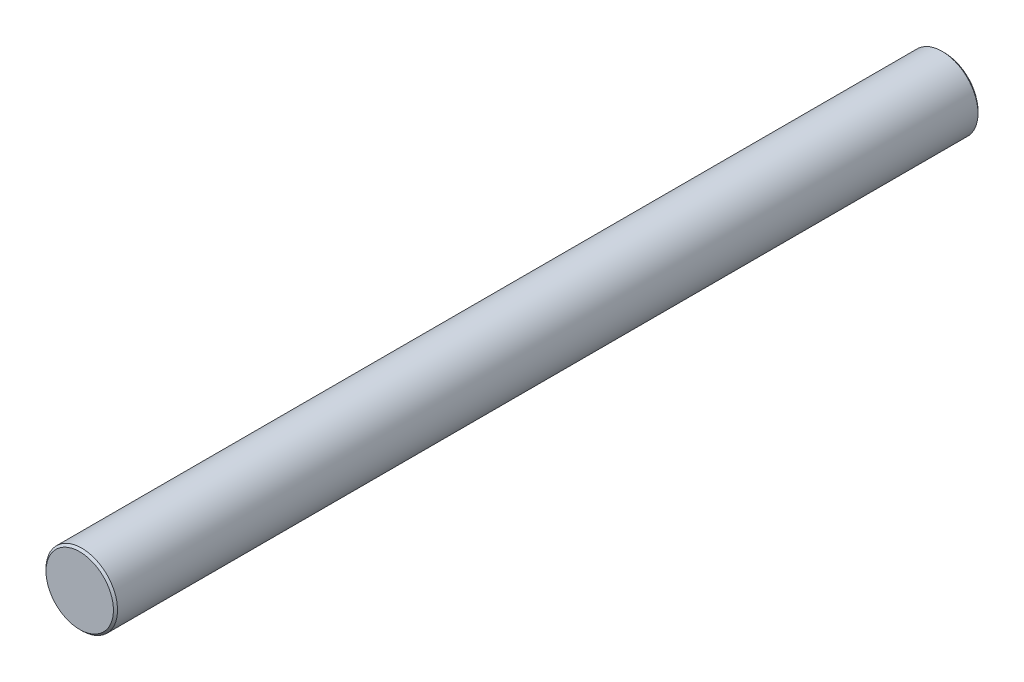
ISO-10303-21;
HEADER;
FILE_DESCRIPTION(('STEP AP214'),'2;1');
FILE_NAME('part.step','',(''),(''),'','','');
FILE_SCHEMA(('AUTOMOTIVE_DESIGN { 1 0 10303 214 1 1 1 1 }'));
ENDSEC;
DATA;
#1=APPLICATION_CONTEXT('core data for automotive mechanical design processes');
#2=APPLICATION_PROTOCOL_DEFINITION('international standard','automotive_design',2000,#1);
#3=PRODUCT_CONTEXT('',#1,'mechanical');
#4=PRODUCT('Part','Part','',(#3));
#5=PRODUCT_RELATED_PRODUCT_CATEGORY('part','',(#4));
#6=PRODUCT_DEFINITION_FORMATION('','',#4);
#7=PRODUCT_DEFINITION_CONTEXT('part definition',#1,'design');
#8=PRODUCT_DEFINITION('design','',#6,#7);
#9=PRODUCT_DEFINITION_SHAPE('','',#8);
#10=(LENGTH_UNIT() NAMED_UNIT(*) SI_UNIT(.MILLI.,.METRE.));
#11=(NAMED_UNIT(*) PLANE_ANGLE_UNIT() SI_UNIT($,.RADIAN.));
#12=(NAMED_UNIT(*) SI_UNIT($,.STERADIAN.) SOLID_ANGLE_UNIT());
#13=UNCERTAINTY_MEASURE_WITH_UNIT(LENGTH_MEASURE(1.E-05),#10,'distance_accuracy_value','');
#14=(GEOMETRIC_REPRESENTATION_CONTEXT(3) GLOBAL_UNCERTAINTY_ASSIGNED_CONTEXT((#13)) GLOBAL_UNIT_ASSIGNED_CONTEXT((#10,
#11,#12)) REPRESENTATION_CONTEXT('',''));
#15=CARTESIAN_POINT('',(0.,0.,0.));
#16=DIRECTION('',(0.,0.,1.));
#17=DIRECTION('',(1.,0.,0.));
#18=AXIS2_PLACEMENT_3D('',#15,#16,#17);
#19=CARTESIAN_POINT('',(0.,0.,42.));
#20=DIRECTION('',(0.,0.,-1.));
#21=DIRECTION('',(-1.,0.,0.));
#22=AXIS2_PLACEMENT_3D('',#19,#20,#21);
#23=CYLINDRICAL_SURFACE('',#22,3.475);
#24=CARTESIAN_POINT('',(0.,0.,-41.7999999999999));
#25=DIRECTION('',(0.,0.,1.));
#26=DIRECTION('',(1.,0.,0.));
#27=AXIS2_PLACEMENT_3D('',#24,#25,#26);
#28=CIRCLE('',#27,3.475);
#29=CARTESIAN_POINT('',(-3.475,0.,-41.7999999999999));
#30=VERTEX_POINT('',#29);
#31=EDGE_CURVE('E49',#30,#30,#28,.T.);
#32=CARTESIAN_POINT('',(0.,0.,41.8000000000001));
#33=DIRECTION('',(0.,0.,1.));
#34=DIRECTION('',(1.,0.,0.));
#35=AXIS2_PLACEMENT_3D('',#32,#33,#34);
#36=CIRCLE('',#35,3.475);
#37=CARTESIAN_POINT('',(-3.475,0.,41.8000000000001));
#38=VERTEX_POINT('',#37);
#39=EDGE_CURVE('E53',#38,#38,#36,.F.);
#40=CARTESIAN_POINT('',(-3.475,0.,-41.7999999999999));
#41=CARTESIAN_POINT('',(-3.475,0.,-40.9291666666666));
#42=CARTESIAN_POINT('',(-3.475,0.,-40.0583333333333));
#43=CARTESIAN_POINT('',(-3.475,0.,-38.3166666666666));
#44=CARTESIAN_POINT('',(-3.475,0.,-37.4458333333333));
#45=CARTESIAN_POINT('',(-3.475,0.,-35.7041666666666));
#46=CARTESIAN_POINT('',(-3.475,0.,-34.8333333333333));
#47=CARTESIAN_POINT('',(-3.475,0.,-33.0916666666666));
#48=CARTESIAN_POINT('',(-3.475,0.,-32.2208333333333));
#49=CARTESIAN_POINT('',(-3.475,0.,-30.4791666666666));
#50=CARTESIAN_POINT('',(-3.475,0.,-29.6083333333333));
#51=CARTESIAN_POINT('',(-3.475,0.,-27.8666666666666));
#52=CARTESIAN_POINT('',(-3.475,0.,-26.9958333333333));
#53=CARTESIAN_POINT('',(-3.475,0.,-25.2541666666666));
#54=CARTESIAN_POINT('',(-3.475,0.,-24.3833333333333));
#55=CARTESIAN_POINT('',(-3.475,0.,-22.6416666666666));
#56=CARTESIAN_POINT('',(-3.475,0.,-21.7708333333333));
#57=CARTESIAN_POINT('',(-3.475,0.,-20.0291666666666));
#58=CARTESIAN_POINT('',(-3.475,0.,-19.1583333333333));
#59=CARTESIAN_POINT('',(-3.475,0.,-17.4166666666666));
#60=CARTESIAN_POINT('',(-3.475,0.,-16.5458333333333));
#61=CARTESIAN_POINT('',(-3.475,0.,-14.8041666666666));
#62=CARTESIAN_POINT('',(-3.475,0.,-13.9333333333333));
#63=CARTESIAN_POINT('',(-3.475,0.,-12.1916666666666));
#64=CARTESIAN_POINT('',(-3.475,0.,-11.3208333333333));
#65=CARTESIAN_POINT('',(-3.475,0.,-9.57916666666661));
#66=CARTESIAN_POINT('',(-3.475,0.,-8.70833333333328));
#67=CARTESIAN_POINT('',(-3.475,0.,-6.96666666666661));
#68=CARTESIAN_POINT('',(-3.475,0.,-6.09583333333328));
#69=CARTESIAN_POINT('',(-3.475,0.,-4.35416666666661));
#70=CARTESIAN_POINT('',(-3.475,0.,-3.48333333333328));
#71=CARTESIAN_POINT('',(-3.475,0.,-1.74166666666661));
#72=CARTESIAN_POINT('',(-3.475,0.,-0.870833333333279));
#73=CARTESIAN_POINT('',(-3.475,0.,0.87083333333339));
#74=CARTESIAN_POINT('',(-3.475,0.,1.74166666666672));
#75=CARTESIAN_POINT('',(-3.475,0.,3.48333333333339));
#76=CARTESIAN_POINT('',(-3.475,0.,4.35416666666672));
#77=CARTESIAN_POINT('',(-3.475,0.,6.09583333333339));
#78=CARTESIAN_POINT('',(-3.475,0.,6.96666666666672));
#79=CARTESIAN_POINT('',(-3.475,0.,8.70833333333339));
#80=CARTESIAN_POINT('',(-3.475,0.,9.57916666666672));
#81=CARTESIAN_POINT('',(-3.475,0.,11.3208333333334));
#82=CARTESIAN_POINT('',(-3.475,0.,12.1916666666667));
#83=CARTESIAN_POINT('',(-3.475,0.,13.9333333333334));
#84=CARTESIAN_POINT('',(-3.475,0.,14.8041666666667));
#85=CARTESIAN_POINT('',(-3.475,0.,16.5458333333334));
#86=CARTESIAN_POINT('',(-3.475,0.,17.4166666666667));
#87=CARTESIAN_POINT('',(-3.475,0.,19.1583333333334));
#88=CARTESIAN_POINT('',(-3.475,0.,20.0291666666667));
#89=CARTESIAN_POINT('',(-3.475,0.,21.7708333333334));
#90=CARTESIAN_POINT('',(-3.475,0.,22.6416666666667));
#91=CARTESIAN_POINT('',(-3.475,0.,24.3833333333334));
#92=CARTESIAN_POINT('',(-3.475,0.,25.2541666666667));
#93=CARTESIAN_POINT('',(-3.475,0.,26.9958333333334));
#94=CARTESIAN_POINT('',(-3.475,0.,27.8666666666667));
#95=CARTESIAN_POINT('',(-3.475,0.,29.6083333333334));
#96=CARTESIAN_POINT('',(-3.475,0.,30.4791666666667));
#97=CARTESIAN_POINT('',(-3.475,0.,32.2208333333334));
#98=CARTESIAN_POINT('',(-3.475,0.,33.0916666666667));
#99=CARTESIAN_POINT('',(-3.475,0.,34.8333333333334));
#100=CARTESIAN_POINT('',(-3.475,0.,35.7041666666667));
#101=CARTESIAN_POINT('',(-3.475,0.,37.4458333333334));
#102=CARTESIAN_POINT('',(-3.475,0.,38.3166666666667));
#103=CARTESIAN_POINT('',(-3.475,0.,40.0583333333334));
#104=CARTESIAN_POINT('',(-3.475,0.,40.9291666666667));
#105=CARTESIAN_POINT('',(-3.475,0.,41.8000000000001));
#106=B_SPLINE_CURVE_WITH_KNOTS('',3,(#40,#41,#42,#43,#44,#45,#46,#47,#48,#49,#50,#51,#52,#53,
#54,#55,#56,#57,#58,#59,#60,#61,#62,#63,#64,#65,#66,#67,#68,#69,#70,#71,#72,#73,#74,#75,#76,#77,
#78,#79,#80,#81,#82,#83,#84,#85,#86,#87,#88,#89,#90,#91,#92,#93,#94,#95,#96,#97,#98,#99,#100,
#101,#102,#103,#104,#105),.UNSPECIFIED.,.F.,.F.,(4,2,2,2,2,2,2,2,2,2,2,2,2,2,2,2,2,2,2,2,2,2,2,
2,2,2,2,2,2,2,2,2,4),(0.,2.6125,5.22500000000001,7.8375,10.45,13.0625,15.675,18.2875,20.9,
23.5125,26.125,28.7375,31.35,33.9625,36.575,39.1875,41.8,44.4125,47.025,49.6375,52.25,54.8625,
57.475,60.0875,62.7,65.3125,67.925,70.5375,73.15,75.7625,78.375,80.9875,83.6),.UNSPECIFIED.);
#107=EDGE_CURVE('BSEAM37',#30,#38,#106,.T.);
#108=ORIENTED_EDGE('',*,*,#31,.T.);
#109=ORIENTED_EDGE('',*,*,#39,.T.);
#110=ORIENTED_EDGE('',*,*,#107,.T.);
#111=ORIENTED_EDGE('',*,*,#107,.F.);
#112=EDGE_LOOP('',(#108,#110,#109,#111));
#113=FACE_BOUND('',#112,.T.);
#114=ADVANCED_FACE('F37',(#113),#23,.T.);
#115=CARTESIAN_POINT('',(0.,0.,42.));
#116=DIRECTION('',(0.,0.,1.));
#117=DIRECTION('',(1.,0.,0.));
#118=AXIS2_PLACEMENT_3D('',#115,#116,#117);
#119=PLANE('',#118);
#120=CARTESIAN_POINT('',(0.,0.,42.));
#121=DIRECTION('',(0.,0.,1.));
#122=DIRECTION('',(1.,0.,0.));
#123=AXIS2_PLACEMENT_3D('',#120,#121,#122);
#124=CIRCLE('',#123,3.27500000000004);
#125=CARTESIAN_POINT('',(-3.27500000000004,0.,42.));
#126=VERTEX_POINT('',#125);
#127=EDGE_CURVE('E10',#126,#126,#124,.T.);
#128=ORIENTED_EDGE('',*,*,#127,.T.);
#129=EDGE_LOOP('',(#128));
#130=FACE_BOUND('',#129,.T.);
#131=ADVANCED_FACE('F69',(#130),#119,.T.);
#132=CARTESIAN_POINT('',(0.,0.,-42.));
#133=DIRECTION('',(0.,0.,1.));
#134=DIRECTION('',(1.,0.,0.));
#135=AXIS2_PLACEMENT_3D('',#132,#133,#134);
#136=PLANE('',#135);
#137=CARTESIAN_POINT('',(0.,0.,-42.));
#138=DIRECTION('',(0.,0.,1.));
#139=DIRECTION('',(1.,0.,0.));
#140=AXIS2_PLACEMENT_3D('',#137,#138,#139);
#141=CIRCLE('',#140,3.27499999999993);
#142=CARTESIAN_POINT('',(3.27499999999993,0.,-42.));
#143=VERTEX_POINT('',#142);
#144=EDGE_CURVE('E45',#143,#143,#141,.F.);
#145=ORIENTED_EDGE('',*,*,#144,.T.);
#146=EDGE_LOOP('',(#145));
#147=FACE_BOUND('',#146,.T.);
#148=ADVANCED_FACE('F66',(#147),#136,.F.);
#149=CARTESIAN_POINT('',(0.,0.,-41.7999999999999));
#150=DIRECTION('',(0.,0.,1.));
#151=DIRECTION('',(1.,0.,0.));
#152=AXIS2_PLACEMENT_3D('',#149,#150,#151);
#153=CONICAL_SURFACE('',#152,3.475,0.785398163397437);
#154=ORIENTED_EDGE('',*,*,#144,.F.);
#155=EDGE_LOOP('',(#154));
#156=FACE_BOUND('',#155,.T.);
#157=ORIENTED_EDGE('',*,*,#31,.F.);
#158=EDGE_LOOP('',(#157));
#159=FACE_BOUND('',#158,.T.);
#160=ADVANCED_FACE('F62',(#156,#159),#153,.T.);
#161=CARTESIAN_POINT('',(0.,0.,42.));
#162=DIRECTION('',(0.,0.,-1.));
#163=DIRECTION('',(-1.,0.,0.));
#164=AXIS2_PLACEMENT_3D('',#161,#162,#163);
#165=CONICAL_SURFACE('',#164,3.27500000000004,0.785398163397471);
#166=CARTESIAN_POINT('',(-3.475,0.,41.8000000000001));
#167=CARTESIAN_POINT('',(-3.47291666666667,0.,41.8020833333334));
#168=CARTESIAN_POINT('',(-3.47083333333334,0.,41.8041666666667));
#169=CARTESIAN_POINT('',(-3.46666666666667,0.,41.8083333333334));
#170=CARTESIAN_POINT('',(-3.46458333333334,0.,41.8104166666667));
#171=CARTESIAN_POINT('',(-3.46041666666667,0.,41.8145833333334));
#172=CARTESIAN_POINT('',(-3.45833333333334,0.,41.8166666666667));
#173=CARTESIAN_POINT('',(-3.45416666666667,0.,41.8208333333334));
#174=CARTESIAN_POINT('',(-3.45208333333334,0.,41.8229166666667));
#175=CARTESIAN_POINT('',(-3.44791666666668,0.,41.8270833333334));
#176=CARTESIAN_POINT('',(-3.44583333333334,0.,41.8291666666667));
#177=CARTESIAN_POINT('',(-3.44166666666668,0.,41.8333333333334));
#178=CARTESIAN_POINT('',(-3.43958333333334,0.,41.8354166666667));
#179=CARTESIAN_POINT('',(-3.43541666666668,0.,41.8395833333334));
#180=CARTESIAN_POINT('',(-3.43333333333335,0.,41.8416666666667));
#181=CARTESIAN_POINT('',(-3.42916666666668,0.,41.8458333333334));
#182=CARTESIAN_POINT('',(-3.42708333333335,0.,41.8479166666667));
#183=CARTESIAN_POINT('',(-3.42291666666668,0.,41.8520833333334));
#184=CARTESIAN_POINT('',(-3.42083333333335,0.,41.8541666666667));
#185=CARTESIAN_POINT('',(-3.41666666666668,0.,41.8583333333334));
#186=CARTESIAN_POINT('',(-3.41458333333335,0.,41.8604166666667));
#187=CARTESIAN_POINT('',(-3.41041666666668,0.,41.8645833333334));
#188=CARTESIAN_POINT('',(-3.40833333333335,0.,41.8666666666667));
#189=CARTESIAN_POINT('',(-3.40416666666668,0.,41.8708333333334));
#190=CARTESIAN_POINT('',(-3.40208333333335,0.,41.8729166666667));
#191=CARTESIAN_POINT('',(-3.39791666666669,0.,41.8770833333334));
#192=CARTESIAN_POINT('',(-3.39583333333335,0.,41.8791666666667));
#193=CARTESIAN_POINT('',(-3.39166666666669,0.,41.8833333333334));
#194=CARTESIAN_POINT('',(-3.38958333333336,0.,41.8854166666667));
#195=CARTESIAN_POINT('',(-3.38541666666669,0.,41.8895833333334));
#196=CARTESIAN_POINT('',(-3.38333333333336,0.,41.8916666666667));
#197=CARTESIAN_POINT('',(-3.37916666666669,0.,41.8958333333334));
#198=CARTESIAN_POINT('',(-3.37708333333336,0.,41.8979166666667));
#199=CARTESIAN_POINT('',(-3.37291666666669,0.,41.9020833333334));
#200=CARTESIAN_POINT('',(-3.37083333333336,0.,41.9041666666667));
#201=CARTESIAN_POINT('',(-3.36666666666669,0.,41.9083333333334));
#202=CARTESIAN_POINT('',(-3.36458333333336,0.,41.9104166666667));
#203=CARTESIAN_POINT('',(-3.36041666666669,0.,41.9145833333334));
#204=CARTESIAN_POINT('',(-3.35833333333336,0.,41.9166666666667));
#205=CARTESIAN_POINT('',(-3.3541666666667,0.,41.9208333333333));
#206=CARTESIAN_POINT('',(-3.35208333333336,0.,41.9229166666667));
#207=CARTESIAN_POINT('',(-3.3479166666667,0.,41.9270833333333));
#208=CARTESIAN_POINT('',(-3.34583333333336,0.,41.9291666666667));
#209=CARTESIAN_POINT('',(-3.3416666666667,0.,41.9333333333334));
#210=CARTESIAN_POINT('',(-3.33958333333337,0.,41.9354166666667));
#211=CARTESIAN_POINT('',(-3.3354166666667,0.,41.9395833333334));
#212=CARTESIAN_POINT('',(-3.33333333333337,0.,41.9416666666667));
#213=CARTESIAN_POINT('',(-3.3291666666667,0.,41.9458333333333));
#214=CARTESIAN_POINT('',(-3.32708333333337,0.,41.9479166666667));
#215=CARTESIAN_POINT('',(-3.3229166666667,0.,41.9520833333333));
#216=CARTESIAN_POINT('',(-3.32083333333337,0.,41.9541666666667));
#217=CARTESIAN_POINT('',(-3.3166666666667,0.,41.9583333333333));
#218=CARTESIAN_POINT('',(-3.31458333333337,0.,41.9604166666667));
#219=CARTESIAN_POINT('',(-3.3104166666667,0.,41.9645833333333));
#220=CARTESIAN_POINT('',(-3.30833333333337,0.,41.9666666666667));
#221=CARTESIAN_POINT('',(-3.30416666666671,0.,41.9708333333333));
#222=CARTESIAN_POINT('',(-3.30208333333337,0.,41.9729166666667));
#223=CARTESIAN_POINT('',(-3.29791666666671,0.,41.9770833333333));
#224=CARTESIAN_POINT('',(-3.29583333333337,0.,41.9791666666667));
#225=CARTESIAN_POINT('',(-3.29166666666671,0.,41.9833333333333));
#226=CARTESIAN_POINT('',(-3.28958333333338,0.,41.9854166666667));
#227=CARTESIAN_POINT('',(-3.28541666666671,0.,41.9895833333333));
#228=CARTESIAN_POINT('',(-3.28333333333338,0.,41.9916666666667));
#229=CARTESIAN_POINT('',(-3.27916666666671,0.,41.9958333333333));
#230=CARTESIAN_POINT('',(-3.27708333333338,0.,41.9979166666667));
#231=CARTESIAN_POINT('',(-3.27500000000004,0.,42.));
#232=B_SPLINE_CURVE_WITH_KNOTS('',3,(#166,#167,#168,#169,#170,#171,#172,#173,#174,#175,#176,
#177,#178,#179,#180,#181,#182,#183,#184,#185,#186,#187,#188,#189,#190,#191,#192,#193,#194,#195,
#196,#197,#198,#199,#200,#201,#202,#203,#204,#205,#206,#207,#208,#209,#210,#211,#212,#213,#214,
#215,#216,#217,#218,#219,#220,#221,#222,#223,#224,#225,#226,#227,#228,#229,#230,#231),
.UNSPECIFIED.,.F.,.F.,(4,2,2,2,2,2,2,2,2,2,2,2,2,2,2,2,2,2,2,2,2,2,2,2,2,2,2,2,2,2,2,2,4),(0.,
0.00883883476482566,0.0176776695296559,0.0265165042944865,0.035355339059317,0.0441941738241473,
0.0530330085889779,0.0618718433538084,0.0707106781186387,0.0795495128834643,0.0883883476482949,
0.0972271824131252,0.106066017177956,0.114904851942786,0.123743686707617,0.132582521472447,
0.141421356237277,0.150260191002103,0.159099025766934,0.167937860531764,0.176776695296594,
0.185615530061425,0.194454364826255,0.203293199591086,0.212132034355916,0.220970869120742,
0.229809703885572,0.238648538650403,0.247487373415233,0.256326208180064,0.265165042944894,
0.274003877709724,0.282842712474555),.UNSPECIFIED.);
#233=EDGE_CURVE('BSEAM40',#38,#126,#232,.T.);
#234=ORIENTED_EDGE('',*,*,#39,.F.);
#235=ORIENTED_EDGE('',*,*,#127,.F.);
#236=ORIENTED_EDGE('',*,*,#233,.T.);
#237=ORIENTED_EDGE('',*,*,#233,.F.);
#238=EDGE_LOOP('',(#234,#236,#235,#237));
#239=FACE_BOUND('',#238,.T.);
#240=ADVANCED_FACE('F40',(#239),#165,.T.);
#241=CLOSED_SHELL('',(#114,#131,#148,#160,#240));
#242=MANIFOLD_SOLID_BREP('B2',#241);
#243=ADVANCED_BREP_SHAPE_REPRESENTATION('',(#18,#242),#14);
#244=SHAPE_DEFINITION_REPRESENTATION(#9,#243);
ENDSEC;
END-ISO-10303-21;
